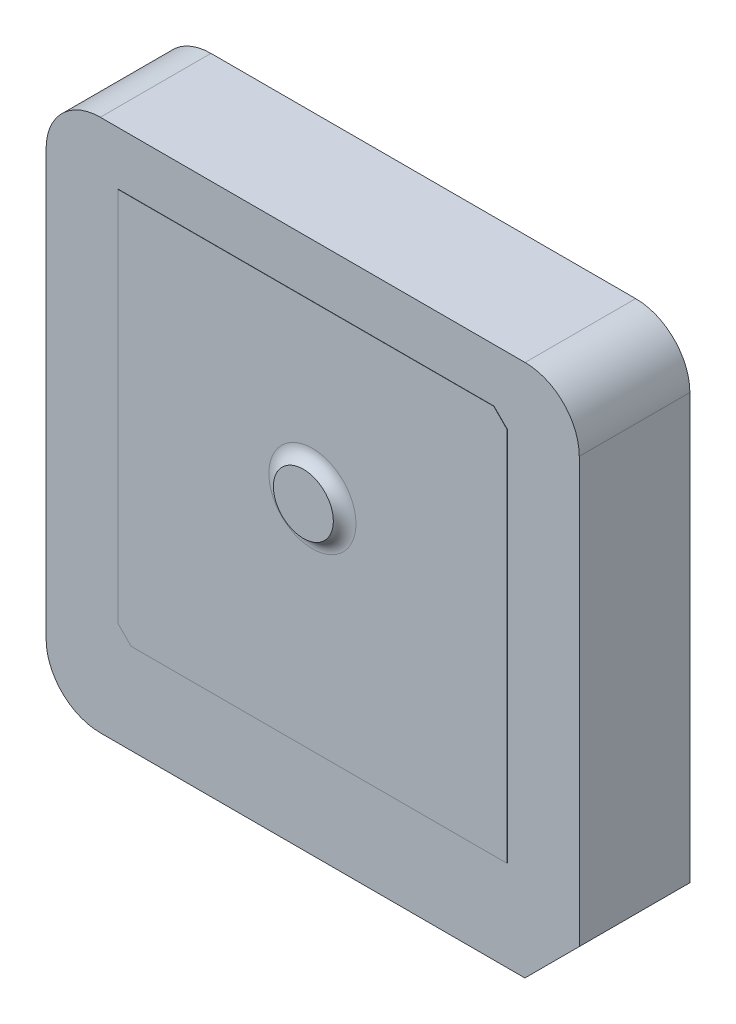
ISO-10303-21;
HEADER;
FILE_DESCRIPTION(('STEP AP214'),'2;1');
FILE_NAME('part.step','',(''),(''),'','','');
FILE_SCHEMA(('AUTOMOTIVE_DESIGN { 1 0 10303 214 1 1 1 1 }'));
ENDSEC;
DATA;
#1=APPLICATION_CONTEXT('core data for automotive mechanical design processes');
#2=APPLICATION_PROTOCOL_DEFINITION('international standard','automotive_design',2000,#1);
#3=PRODUCT_CONTEXT('',#1,'mechanical');
#4=PRODUCT('Part','Part','',(#3));
#5=PRODUCT_RELATED_PRODUCT_CATEGORY('part','',(#4));
#6=PRODUCT_DEFINITION_FORMATION('','',#4);
#7=PRODUCT_DEFINITION_CONTEXT('part definition',#1,'design');
#8=PRODUCT_DEFINITION('design','',#6,#7);
#9=PRODUCT_DEFINITION_SHAPE('','',#8);
#10=(LENGTH_UNIT() NAMED_UNIT(*) SI_UNIT(.MILLI.,.METRE.));
#11=(NAMED_UNIT(*) PLANE_ANGLE_UNIT() SI_UNIT($,.RADIAN.));
#12=(NAMED_UNIT(*) SI_UNIT($,.STERADIAN.) SOLID_ANGLE_UNIT());
#13=UNCERTAINTY_MEASURE_WITH_UNIT(LENGTH_MEASURE(1.E-05),#10,'distance_accuracy_value','');
#14=(GEOMETRIC_REPRESENTATION_CONTEXT(3) GLOBAL_UNCERTAINTY_ASSIGNED_CONTEXT((#13)) GLOBAL_UNIT_ASSIGNED_CONTEXT((#10,
#11,#12)) REPRESENTATION_CONTEXT('',''));
#15=CARTESIAN_POINT('',(0.,0.,0.));
#16=DIRECTION('',(0.,0.,1.));
#17=DIRECTION('',(1.,0.,0.));
#18=AXIS2_PLACEMENT_3D('',#15,#16,#17);
#19=CARTESIAN_POINT('',(-10.,10.,4.15));
#20=DIRECTION('',(1.,0.,0.));
#21=DIRECTION('',(0.,1.,0.));
#22=AXIS2_PLACEMENT_3D('',#19,#20,#21);
#23=PLANE('',#22);
#24=DIRECTION('',(0.,-1.,0.));
#25=VECTOR('',#24,1.);
#26=CARTESIAN_POINT('',(-10.,10.,4.15));
#27=LINE('',#26,#25);
#28=CARTESIAN_POINT('',(-10.,7.96690475583121,4.15));
#29=VERTEX_POINT('',#28);
#30=CARTESIAN_POINT('',(-10.,-7.96690475583121,4.15));
#31=VERTEX_POINT('',#30);
#32=EDGE_CURVE('E162',#29,#31,#27,.T.);
#33=ORIENTED_EDGE('',*,*,#32,.F.);
#34=DIRECTION('',(0.,0.,1.));
#35=VECTOR('',#34,1.);
#36=CARTESIAN_POINT('',(-10.,7.96690475583121,0.));
#37=LINE('',#36,#35);
#38=CARTESIAN_POINT('',(-10.,7.96690475583121,0.));
#39=VERTEX_POINT('',#38);
#40=EDGE_CURVE('E253',#39,#29,#37,.T.);
#41=ORIENTED_EDGE('',*,*,#40,.F.);
#42=DIRECTION('',(0.,-1.,0.));
#43=VECTOR('',#42,1.);
#44=CARTESIAN_POINT('',(-10.,10.,0.));
#45=LINE('',#44,#43);
#46=CARTESIAN_POINT('',(-10.,-7.96690475583121,0.));
#47=VERTEX_POINT('',#46);
#48=EDGE_CURVE('E164',#39,#47,#45,.T.);
#49=ORIENTED_EDGE('',*,*,#48,.T.);
#50=DIRECTION('',(0.,0.,1.));
#51=VECTOR('',#50,1.);
#52=CARTESIAN_POINT('',(-10.,-7.96690475583121,0.));
#53=LINE('',#52,#51);
#54=EDGE_CURVE('E252',#47,#31,#53,.T.);
#55=ORIENTED_EDGE('',*,*,#54,.T.);
#56=EDGE_LOOP('',(#33,#41,#49,#55));
#57=FACE_BOUND('',#56,.T.);
#58=ADVANCED_FACE('F37',(#57),#23,.F.);
#59=CARTESIAN_POINT('',(10.,10.,4.15));
#60=DIRECTION('',(-1.,0.,0.));
#61=DIRECTION('',(0.,0.,1.));
#62=AXIS2_PLACEMENT_3D('',#59,#60,#61);
#63=PLANE('',#62);
#64=DIRECTION('',(0.,0.,1.));
#65=VECTOR('',#64,1.);
#66=CARTESIAN_POINT('',(10.,7.96690475583121,0.));
#67=LINE('',#66,#65);
#68=CARTESIAN_POINT('',(10.,7.96690475583121,0.));
#69=VERTEX_POINT('',#68);
#70=CARTESIAN_POINT('',(10.,7.96690475583121,4.15));
#71=VERTEX_POINT('',#70);
#72=EDGE_CURVE('E60',#69,#71,#67,.T.);
#73=ORIENTED_EDGE('',*,*,#72,.T.);
#74=DIRECTION('',(0.,1.,0.));
#75=VECTOR('',#74,1.);
#76=CARTESIAN_POINT('',(10.,10.,4.15));
#77=LINE('',#76,#75);
#78=CARTESIAN_POINT('',(10.,-7.96051224213831,4.15));
#79=VERTEX_POINT('',#78);
#80=EDGE_CURVE('E152',#79,#71,#77,.T.);
#81=ORIENTED_EDGE('',*,*,#80,.F.);
#82=DIRECTION('',(0.,0.,1.));
#83=VECTOR('',#82,1.);
#84=CARTESIAN_POINT('',(10.,-7.96051224213831,0.));
#85=LINE('',#84,#83);
#86=CARTESIAN_POINT('',(10.,-7.96051224213831,0.));
#87=VERTEX_POINT('',#86);
#88=EDGE_CURVE('E138',#87,#79,#85,.T.);
#89=ORIENTED_EDGE('',*,*,#88,.F.);
#90=DIRECTION('',(0.,1.,0.));
#91=VECTOR('',#90,1.);
#92=CARTESIAN_POINT('',(10.,10.,0.));
#93=LINE('',#92,#91);
#94=EDGE_CURVE('E150',#87,#69,#93,.T.);
#95=ORIENTED_EDGE('',*,*,#94,.T.);
#96=EDGE_LOOP('',(#73,#81,#89,#95));
#97=FACE_BOUND('',#96,.T.);
#98=ADVANCED_FACE('F149',(#97),#63,.F.);
#99=CARTESIAN_POINT('',(-10.,10.,4.15));
#100=DIRECTION('',(0.,-1.,0.));
#101=DIRECTION('',(0.,0.,-1.));
#102=AXIS2_PLACEMENT_3D('',#99,#100,#101);
#103=PLANE('',#102);
#104=DIRECTION('',(0.,0.,1.));
#105=VECTOR('',#104,1.);
#106=CARTESIAN_POINT('',(-7.96690475583121,10.,0.));
#107=LINE('',#106,#105);
#108=CARTESIAN_POINT('',(-7.96690475583121,10.,0.));
#109=VERTEX_POINT('',#108);
#110=CARTESIAN_POINT('',(-7.96690475583121,10.,4.15));
#111=VERTEX_POINT('',#110);
#112=EDGE_CURVE('E264',#109,#111,#107,.T.);
#113=ORIENTED_EDGE('',*,*,#112,.T.);
#114=DIRECTION('',(-1.,0.,0.));
#115=VECTOR('',#114,1.);
#116=CARTESIAN_POINT('',(-10.,10.,4.15));
#117=LINE('',#116,#115);
#118=CARTESIAN_POINT('',(7.96690475583121,10.,4.15));
#119=VERTEX_POINT('',#118);
#120=EDGE_CURVE('E172',#119,#111,#117,.T.);
#121=ORIENTED_EDGE('',*,*,#120,.F.);
#122=DIRECTION('',(0.,0.,1.));
#123=VECTOR('',#122,1.);
#124=CARTESIAN_POINT('',(7.96690475583121,10.,0.));
#125=LINE('',#124,#123);
#126=CARTESIAN_POINT('',(7.96690475583121,10.,0.));
#127=VERTEX_POINT('',#126);
#128=EDGE_CURVE('E280',#127,#119,#125,.T.);
#129=ORIENTED_EDGE('',*,*,#128,.F.);
#130=DIRECTION('',(-1.,0.,0.));
#131=VECTOR('',#130,1.);
#132=CARTESIAN_POINT('',(-10.,10.,0.));
#133=LINE('',#132,#131);
#134=EDGE_CURVE('E158',#127,#109,#133,.T.);
#135=ORIENTED_EDGE('',*,*,#134,.T.);
#136=EDGE_LOOP('',(#113,#121,#129,#135));
#137=FACE_BOUND('',#136,.T.);
#138=ADVANCED_FACE('F290',(#137),#103,.F.);
#139=CARTESIAN_POINT('',(0.,0.,4.15));
#140=DIRECTION('',(0.,0.,1.));
#141=DIRECTION('',(1.,0.,0.));
#142=AXIS2_PLACEMENT_3D('',#139,#140,#141);
#143=PLANE('',#142);
#144=CARTESIAN_POINT('',(-7.96690475583121,7.96690475583121,4.15));
#145=DIRECTION('',(0.,0.,-1.));
#146=DIRECTION('',(-1.,0.,0.));
#147=AXIS2_PLACEMENT_3D('',#144,#145,#146);
#148=CIRCLE('',#147,2.03309524416879);
#149=EDGE_CURVE('E284',#29,#111,#148,.T.);
#150=ORIENTED_EDGE('',*,*,#149,.F.);
#151=ORIENTED_EDGE('',*,*,#32,.T.);
#152=CARTESIAN_POINT('',(-7.96690475583122,-7.96690475583121,4.15));
#153=DIRECTION('',(0.,0.,-1.));
#154=DIRECTION('',(-1.,0.,0.));
#155=AXIS2_PLACEMENT_3D('',#152,#153,#154);
#156=CIRCLE('',#155,2.03309524416879);
#157=CARTESIAN_POINT('',(-7.96690475583122,-10.,4.15));
#158=VERTEX_POINT('',#157);
#159=EDGE_CURVE('E260',#158,#31,#156,.T.);
#160=ORIENTED_EDGE('',*,*,#159,.F.);
#161=DIRECTION('',(1.,0.,0.));
#162=VECTOR('',#161,1.);
#163=CARTESIAN_POINT('',(-10.,-10.,4.15));
#164=LINE('',#163,#162);
#165=CARTESIAN_POINT('',(7.96051224213829,-10.,4.15));
#166=VERTEX_POINT('',#165);
#167=EDGE_CURVE('E242',#158,#166,#164,.T.);
#168=ORIENTED_EDGE('',*,*,#167,.T.);
#169=DIRECTION('',(-0.707106781186549,-0.707106781186546,0.));
#170=VECTOR('',#169,1.);
#171=CARTESIAN_POINT('',(7.96051224213829,-10.,4.15));
#172=LINE('',#171,#170);
#173=EDGE_CURVE('E144',#79,#166,#172,.T.);
#174=ORIENTED_EDGE('',*,*,#173,.F.);
#175=ORIENTED_EDGE('',*,*,#80,.T.);
#176=CARTESIAN_POINT('',(7.96690475583121,7.96690475583121,4.15));
#177=DIRECTION('',(0.,0.,-1.));
#178=DIRECTION('',(-1.,0.,0.));
#179=AXIS2_PLACEMENT_3D('',#176,#177,#178);
#180=CIRCLE('',#179,2.03309524416879);
#181=EDGE_CURVE('E278',#119,#71,#180,.T.);
#182=ORIENTED_EDGE('',*,*,#181,.F.);
#183=ORIENTED_EDGE('',*,*,#120,.T.);
#184=EDGE_LOOP('',(#150,#151,#160,#168,#174,#175,#182,#183));
#185=FACE_BOUND('',#184,.T.);
#186=DIRECTION('',(1.,0.,0.));
#187=VECTOR('',#186,1.);
#188=CARTESIAN_POINT('',(-7.3,-6.6,4.15));
#189=LINE('',#188,#187);
#190=CARTESIAN_POINT('',(-6.8,-6.6,4.15));
#191=VERTEX_POINT('',#190);
#192=CARTESIAN_POINT('',(7.3,-6.6,4.15));
#193=VERTEX_POINT('',#192);
#194=EDGE_CURVE('E195',#191,#193,#189,.T.);
#195=ORIENTED_EDGE('',*,*,#194,.F.);
#196=DIRECTION('',(0.707106781186545,-0.70710678118655,0.));
#197=VECTOR('',#196,1.);
#198=CARTESIAN_POINT('',(-6.8,-6.6,4.15));
#199=LINE('',#198,#197);
#200=CARTESIAN_POINT('',(-7.3,-6.1,4.15));
#201=VERTEX_POINT('',#200);
#202=EDGE_CURVE('E45',#191,#201,#199,.F.);
#203=ORIENTED_EDGE('',*,*,#202,.T.);
#204=DIRECTION('',(0.,-1.,0.));
#205=VECTOR('',#204,1.);
#206=CARTESIAN_POINT('',(-7.3,8.,4.15));
#207=LINE('',#206,#205);
#208=CARTESIAN_POINT('',(-7.3,8.,4.15));
#209=VERTEX_POINT('',#208);
#210=EDGE_CURVE('E193',#209,#201,#207,.T.);
#211=ORIENTED_EDGE('',*,*,#210,.F.);
#212=DIRECTION('',(-1.,0.,0.));
#213=VECTOR('',#212,1.);
#214=CARTESIAN_POINT('',(-7.3,8.,4.15));
#215=LINE('',#214,#213);
#216=CARTESIAN_POINT('',(6.8,8.,4.15));
#217=VERTEX_POINT('',#216);
#218=EDGE_CURVE('E225',#217,#209,#215,.T.);
#219=ORIENTED_EDGE('',*,*,#218,.F.);
#220=DIRECTION('',(-0.707106781186545,0.70710678118655,0.));
#221=VECTOR('',#220,1.);
#222=CARTESIAN_POINT('',(6.8,8.,4.15));
#223=LINE('',#222,#221);
#224=CARTESIAN_POINT('',(7.3,7.5,4.15));
#225=VERTEX_POINT('',#224);
#226=EDGE_CURVE('E186',#217,#225,#223,.F.);
#227=ORIENTED_EDGE('',*,*,#226,.T.);
#228=DIRECTION('',(0.,1.,0.));
#229=VECTOR('',#228,1.);
#230=CARTESIAN_POINT('',(7.3,8.,4.15));
#231=LINE('',#230,#229);
#232=EDGE_CURVE('E231',#193,#225,#231,.T.);
#233=ORIENTED_EDGE('',*,*,#232,.F.);
#234=EDGE_LOOP('',(#195,#203,#211,#219,#227,#233));
#235=FACE_BOUND('',#234,.T.);
#236=ADVANCED_FACE('F191',(#185,#235),#143,.T.);
#237=CARTESIAN_POINT('',(-10.,-10.,4.15));
#238=DIRECTION('',(0.,1.,0.));
#239=DIRECTION('',(0.,0.,1.));
#240=AXIS2_PLACEMENT_3D('',#237,#238,#239);
#241=PLANE('',#240);
#242=DIRECTION('',(1.,0.,0.));
#243=VECTOR('',#242,1.);
#244=CARTESIAN_POINT('',(-10.,-10.,0.));
#245=LINE('',#244,#243);
#246=CARTESIAN_POINT('',(-7.96690475583122,-10.,0.));
#247=VERTEX_POINT('',#246);
#248=CARTESIAN_POINT('',(7.96051224213829,-10.,0.));
#249=VERTEX_POINT('',#248);
#250=EDGE_CURVE('E159',#247,#249,#245,.T.);
#251=ORIENTED_EDGE('',*,*,#250,.T.);
#252=DIRECTION('',(0.,0.,1.));
#253=VECTOR('',#252,1.);
#254=CARTESIAN_POINT('',(7.96051224213829,-10.,0.));
#255=LINE('',#254,#253);
#256=EDGE_CURVE('E52',#249,#166,#255,.T.);
#257=ORIENTED_EDGE('',*,*,#256,.T.);
#258=ORIENTED_EDGE('',*,*,#167,.F.);
#259=DIRECTION('',(0.,0.,1.));
#260=VECTOR('',#259,1.);
#261=CARTESIAN_POINT('',(-7.96690475583122,-10.,0.));
#262=LINE('',#261,#260);
#263=EDGE_CURVE('E206',#247,#158,#262,.T.);
#264=ORIENTED_EDGE('',*,*,#263,.F.);
#265=EDGE_LOOP('',(#251,#257,#258,#264));
#266=FACE_BOUND('',#265,.T.);
#267=ADVANCED_FACE('F273',(#266),#241,.F.);
#268=CARTESIAN_POINT('',(0.,0.,0.));
#269=DIRECTION('',(0.,0.,1.));
#270=DIRECTION('',(1.,0.,0.));
#271=AXIS2_PLACEMENT_3D('',#268,#269,#270);
#272=PLANE('',#271);
#273=CARTESIAN_POINT('',(0.,1.6,0.));
#274=DIRECTION('',(0.,0.,1.));
#275=DIRECTION('',(1.,0.,0.));
#276=AXIS2_PLACEMENT_3D('',#273,#274,#275);
#277=CIRCLE('',#276,0.4);
#278=CARTESIAN_POINT('',(0.4,1.6,0.));
#279=VERTEX_POINT('',#278);
#280=EDGE_CURVE('E11',#279,#279,#277,.F.);
#281=ORIENTED_EDGE('',*,*,#280,.F.);
#282=EDGE_LOOP('',(#281));
#283=FACE_BOUND('',#282,.T.);
#284=ORIENTED_EDGE('',*,*,#48,.F.);
#285=CARTESIAN_POINT('',(-7.96690475583121,7.96690475583121,0.));
#286=DIRECTION('',(0.,0.,-1.));
#287=DIRECTION('',(-1.,0.,0.));
#288=AXIS2_PLACEMENT_3D('',#285,#286,#287);
#289=CIRCLE('',#288,2.03309524416879);
#290=EDGE_CURVE('E256',#39,#109,#289,.T.);
#291=ORIENTED_EDGE('',*,*,#290,.T.);
#292=ORIENTED_EDGE('',*,*,#134,.F.);
#293=CARTESIAN_POINT('',(7.96690475583121,7.96690475583121,0.));
#294=DIRECTION('',(0.,0.,-1.));
#295=DIRECTION('',(-1.,0.,0.));
#296=AXIS2_PLACEMENT_3D('',#293,#294,#295);
#297=CIRCLE('',#296,2.03309524416879);
#298=EDGE_CURVE('E157',#127,#69,#297,.T.);
#299=ORIENTED_EDGE('',*,*,#298,.T.);
#300=ORIENTED_EDGE('',*,*,#94,.F.);
#301=DIRECTION('',(-0.707106781186549,-0.707106781186546,0.));
#302=VECTOR('',#301,1.);
#303=CARTESIAN_POINT('',(7.96051224213829,-10.,0.));
#304=LINE('',#303,#302);
#305=EDGE_CURVE('E135',#87,#249,#304,.T.);
#306=ORIENTED_EDGE('',*,*,#305,.T.);
#307=ORIENTED_EDGE('',*,*,#250,.F.);
#308=CARTESIAN_POINT('',(-7.96690475583122,-7.96690475583121,0.));
#309=DIRECTION('',(0.,0.,-1.));
#310=DIRECTION('',(-1.,0.,0.));
#311=AXIS2_PLACEMENT_3D('',#308,#309,#310);
#312=CIRCLE('',#311,2.03309524416879);
#313=EDGE_CURVE('E257',#247,#47,#312,.T.);
#314=ORIENTED_EDGE('',*,*,#313,.T.);
#315=EDGE_LOOP('',(#284,#291,#292,#299,#300,#306,#307,#314));
#316=FACE_BOUND('',#315,.T.);
#317=ADVANCED_FACE('F155',(#283,#316),#272,.F.);
#318=CARTESIAN_POINT('',(-7.3,8.,4.16));
#319=DIRECTION('',(1.,0.,0.));
#320=DIRECTION('',(0.,1.,0.));
#321=AXIS2_PLACEMENT_3D('',#318,#319,#320);
#322=PLANE('',#321);
#323=ORIENTED_EDGE('',*,*,#210,.T.);
#324=DIRECTION('',(0.,0.,1.));
#325=VECTOR('',#324,1.);
#326=CARTESIAN_POINT('',(-7.3,-6.1,4.16));
#327=LINE('',#326,#325);
#328=CARTESIAN_POINT('',(-7.3,-6.1,4.16));
#329=VERTEX_POINT('',#328);
#330=EDGE_CURVE('E184',#201,#329,#327,.T.);
#331=ORIENTED_EDGE('',*,*,#330,.T.);
#332=DIRECTION('',(0.,-1.,0.));
#333=VECTOR('',#332,1.);
#334=CARTESIAN_POINT('',(-7.3,8.,4.16));
#335=LINE('',#334,#333);
#336=CARTESIAN_POINT('',(-7.3,8.,4.16));
#337=VERTEX_POINT('',#336);
#338=EDGE_CURVE('E215',#337,#329,#335,.T.);
#339=ORIENTED_EDGE('',*,*,#338,.F.);
#340=DIRECTION('',(0.,0.,-1.));
#341=VECTOR('',#340,1.);
#342=CARTESIAN_POINT('',(-7.3,8.,4.16));
#343=LINE('',#342,#341);
#344=EDGE_CURVE('E205',#337,#209,#343,.T.);
#345=ORIENTED_EDGE('',*,*,#344,.T.);
#346=EDGE_LOOP('',(#323,#331,#339,#345));
#347=FACE_BOUND('',#346,.T.);
#348=ADVANCED_FACE('F201',(#347),#322,.F.);
#349=CARTESIAN_POINT('',(-7.3,-6.6,4.16));
#350=DIRECTION('',(0.,1.,0.));
#351=DIRECTION('',(0.,0.,1.));
#352=AXIS2_PLACEMENT_3D('',#349,#350,#351);
#353=PLANE('',#352);
#354=DIRECTION('',(1.,0.,0.));
#355=VECTOR('',#354,1.);
#356=CARTESIAN_POINT('',(-7.3,-6.6,4.16));
#357=LINE('',#356,#355);
#358=CARTESIAN_POINT('',(-6.8,-6.6,4.16));
#359=VERTEX_POINT('',#358);
#360=CARTESIAN_POINT('',(7.3,-6.6,4.16));
#361=VERTEX_POINT('',#360);
#362=EDGE_CURVE('E213',#359,#361,#357,.T.);
#363=ORIENTED_EDGE('',*,*,#362,.F.);
#364=DIRECTION('',(0.,0.,-1.));
#365=VECTOR('',#364,1.);
#366=CARTESIAN_POINT('',(-6.8,-6.6,4.16));
#367=LINE('',#366,#365);
#368=EDGE_CURVE('E181',#359,#191,#367,.T.);
#369=ORIENTED_EDGE('',*,*,#368,.T.);
#370=ORIENTED_EDGE('',*,*,#194,.T.);
#371=DIRECTION('',(0.,0.,-1.));
#372=VECTOR('',#371,1.);
#373=CARTESIAN_POINT('',(7.3,-6.6,4.16));
#374=LINE('',#373,#372);
#375=EDGE_CURVE('E219',#361,#193,#374,.T.);
#376=ORIENTED_EDGE('',*,*,#375,.F.);
#377=EDGE_LOOP('',(#363,#369,#370,#376));
#378=FACE_BOUND('',#377,.T.);
#379=ADVANCED_FACE('F217',(#378),#353,.F.);
#380=CARTESIAN_POINT('',(7.3,8.,4.16));
#381=DIRECTION('',(-1.,0.,0.));
#382=DIRECTION('',(0.,-1.,0.));
#383=AXIS2_PLACEMENT_3D('',#380,#381,#382);
#384=PLANE('',#383);
#385=ORIENTED_EDGE('',*,*,#232,.T.);
#386=DIRECTION('',(0.,0.,1.));
#387=VECTOR('',#386,1.);
#388=CARTESIAN_POINT('',(7.3,7.5,4.16));
#389=LINE('',#388,#387);
#390=CARTESIAN_POINT('',(7.3,7.5,4.16));
#391=VERTEX_POINT('',#390);
#392=EDGE_CURVE('E175',#225,#391,#389,.T.);
#393=ORIENTED_EDGE('',*,*,#392,.T.);
#394=DIRECTION('',(0.,1.,0.));
#395=VECTOR('',#394,1.);
#396=CARTESIAN_POINT('',(7.3,8.,4.16));
#397=LINE('',#396,#395);
#398=EDGE_CURVE('E221',#361,#391,#397,.T.);
#399=ORIENTED_EDGE('',*,*,#398,.F.);
#400=ORIENTED_EDGE('',*,*,#375,.T.);
#401=EDGE_LOOP('',(#385,#393,#399,#400));
#402=FACE_BOUND('',#401,.T.);
#403=ADVANCED_FACE('F329',(#402),#384,.F.);
#404=CARTESIAN_POINT('',(-7.3,8.,4.16));
#405=DIRECTION('',(0.,-1.,0.));
#406=DIRECTION('',(0.,0.,-1.));
#407=AXIS2_PLACEMENT_3D('',#404,#405,#406);
#408=PLANE('',#407);
#409=DIRECTION('',(-1.,0.,0.));
#410=VECTOR('',#409,1.);
#411=CARTESIAN_POINT('',(-7.3,8.,4.16));
#412=LINE('',#411,#410);
#413=CARTESIAN_POINT('',(6.8,8.,4.16));
#414=VERTEX_POINT('',#413);
#415=EDGE_CURVE('E223',#414,#337,#412,.T.);
#416=ORIENTED_EDGE('',*,*,#415,.F.);
#417=DIRECTION('',(0.,0.,-1.));
#418=VECTOR('',#417,1.);
#419=CARTESIAN_POINT('',(6.8,8.,4.16));
#420=LINE('',#419,#418);
#421=EDGE_CURVE('E171',#414,#217,#420,.T.);
#422=ORIENTED_EDGE('',*,*,#421,.T.);
#423=ORIENTED_EDGE('',*,*,#218,.T.);
#424=ORIENTED_EDGE('',*,*,#344,.F.);
#425=EDGE_LOOP('',(#416,#422,#423,#424));
#426=FACE_BOUND('',#425,.T.);
#427=ADVANCED_FACE('F327',(#426),#408,.F.);
#428=CARTESIAN_POINT('',(0.,0.,4.16));
#429=DIRECTION('',(0.,0.,1.));
#430=DIRECTION('',(1.,0.,0.));
#431=AXIS2_PLACEMENT_3D('',#428,#429,#430);
#432=PLANE('',#431);
#433=CARTESIAN_POINT('',(0.,1.6,4.16));
#434=DIRECTION('',(0.,0.,1.));
#435=DIRECTION('',(1.,0.,0.));
#436=AXIS2_PLACEMENT_3D('',#433,#434,#435);
#437=CIRCLE('',#436,1.63333060108555);
#438=CARTESIAN_POINT('',(1.63333060108555,1.6,4.16));
#439=VERTEX_POINT('',#438);
#440=EDGE_CURVE('E168',#439,#439,#437,.F.);
#441=ORIENTED_EDGE('',*,*,#440,.T.);
#442=EDGE_LOOP('',(#441));
#443=FACE_BOUND('',#442,.T.);
#444=ORIENTED_EDGE('',*,*,#398,.T.);
#445=DIRECTION('',(0.707106781186545,-0.70710678118655,0.));
#446=VECTOR('',#445,1.);
#447=CARTESIAN_POINT('',(7.40000000000002,7.39999999999997,4.16));
#448=LINE('',#447,#446);
#449=EDGE_CURVE('E179',#391,#414,#448,.F.);
#450=ORIENTED_EDGE('',*,*,#449,.T.);
#451=ORIENTED_EDGE('',*,*,#415,.T.);
#452=ORIENTED_EDGE('',*,*,#338,.T.);
#453=DIRECTION('',(-0.707106781186545,0.70710678118655,0.));
#454=VECTOR('',#453,1.);
#455=CARTESIAN_POINT('',(-6.70000000000002,-6.69999999999998,4.16));
#456=LINE('',#455,#454);
#457=EDGE_CURVE('E177',#329,#359,#456,.F.);
#458=ORIENTED_EDGE('',*,*,#457,.T.);
#459=ORIENTED_EDGE('',*,*,#362,.T.);
#460=EDGE_LOOP('',(#444,#450,#451,#452,#458,#459));
#461=FACE_BOUND('',#460,.T.);
#462=ADVANCED_FACE('F212',(#443,#461),#432,.T.);
#463=CARTESIAN_POINT('',(0.,1.6,4.5));
#464=DIRECTION('',(0.,0.,1.));
#465=DIRECTION('',(1.,0.,0.));
#466=AXIS2_PLACEMENT_3D('',#463,#464,#465);
#467=PLANE('',#466);
#468=CARTESIAN_POINT('',(0.,1.6,4.5));
#469=DIRECTION('',(0.,0.,1.));
#470=DIRECTION('',(1.,0.,0.));
#471=AXIS2_PLACEMENT_3D('',#468,#469,#470);
#472=CIRCLE('',#471,1.125);
#473=CARTESIAN_POINT('',(1.125,1.6,4.5));
#474=VERTEX_POINT('',#473);
#475=EDGE_CURVE('E237',#474,#474,#472,.T.);
#476=ORIENTED_EDGE('',*,*,#475,.T.);
#477=EDGE_LOOP('',(#476));
#478=FACE_BOUND('',#477,.T.);
#479=ADVANCED_FACE('F315',(#478),#467,.T.);
#480=CARTESIAN_POINT('',(0.,1.6,4.71));
#481=DIRECTION('',(0.,0.,1.));
#482=DIRECTION('',(1.,0.,0.));
#483=AXIS2_PLACEMENT_3D('',#480,#481,#482);
#484=TOROIDAL_SURFACE('',#483,1.63333060108555,0.55);
#485=ORIENTED_EDGE('',*,*,#440,.F.);
#486=EDGE_LOOP('',(#485));
#487=FACE_BOUND('',#486,.T.);
#488=ORIENTED_EDGE('',*,*,#475,.F.);
#489=EDGE_LOOP('',(#488));
#490=FACE_BOUND('',#489,.T.);
#491=ADVANCED_FACE('F312',(#487,#490),#484,.F.);
#492=CARTESIAN_POINT('',(6.8,8.,4.16));
#493=DIRECTION('',(-0.70710678118655,-0.707106781186545,0.));
#494=DIRECTION('',(0.,0.,-1.));
#495=AXIS2_PLACEMENT_3D('',#492,#493,#494);
#496=PLANE('',#495);
#497=ORIENTED_EDGE('',*,*,#449,.F.);
#498=ORIENTED_EDGE('',*,*,#392,.F.);
#499=ORIENTED_EDGE('',*,*,#226,.F.);
#500=ORIENTED_EDGE('',*,*,#421,.F.);
#501=EDGE_LOOP('',(#497,#498,#499,#500));
#502=FACE_BOUND('',#501,.T.);
#503=ADVANCED_FACE('F314',(#502),#496,.F.);
#504=CARTESIAN_POINT('',(-6.8,-6.6,4.16));
#505=DIRECTION('',(0.70710678118655,0.707106781186545,0.));
#506=DIRECTION('',(0.,0.,-1.));
#507=AXIS2_PLACEMENT_3D('',#504,#505,#506);
#508=PLANE('',#507);
#509=ORIENTED_EDGE('',*,*,#457,.F.);
#510=ORIENTED_EDGE('',*,*,#330,.F.);
#511=ORIENTED_EDGE('',*,*,#202,.F.);
#512=ORIENTED_EDGE('',*,*,#368,.F.);
#513=EDGE_LOOP('',(#509,#510,#511,#512));
#514=FACE_BOUND('',#513,.T.);
#515=ADVANCED_FACE('F39',(#514),#508,.F.);
#516=CARTESIAN_POINT('',(-7.96690475583122,-7.96690475583121,0.));
#517=DIRECTION('',(0.,0.,1.));
#518=DIRECTION('',(1.,0.,0.));
#519=AXIS2_PLACEMENT_3D('',#516,#517,#518);
#520=CYLINDRICAL_SURFACE('',#519,2.03309524416879);
#521=ORIENTED_EDGE('',*,*,#159,.T.);
#522=ORIENTED_EDGE('',*,*,#54,.F.);
#523=ORIENTED_EDGE('',*,*,#313,.F.);
#524=ORIENTED_EDGE('',*,*,#263,.T.);
#525=EDGE_LOOP('',(#521,#522,#523,#524));
#526=FACE_BOUND('',#525,.T.);
#527=ADVANCED_FACE('F268',(#526),#520,.T.);
#528=CARTESIAN_POINT('',(7.96051224213829,-10.,0.));
#529=DIRECTION('',(-0.707106781186546,0.707106781186549,0.));
#530=DIRECTION('',(-0.707106781186549,-0.707106781186546,0.));
#531=AXIS2_PLACEMENT_3D('',#528,#529,#530);
#532=PLANE('',#531);
#533=ORIENTED_EDGE('',*,*,#173,.T.);
#534=ORIENTED_EDGE('',*,*,#256,.F.);
#535=ORIENTED_EDGE('',*,*,#305,.F.);
#536=ORIENTED_EDGE('',*,*,#88,.T.);
#537=EDGE_LOOP('',(#533,#534,#535,#536));
#538=FACE_BOUND('',#537,.T.);
#539=ADVANCED_FACE('F137',(#538),#532,.F.);
#540=CARTESIAN_POINT('',(7.96690475583121,7.96690475583121,0.));
#541=DIRECTION('',(0.,0.,1.));
#542=DIRECTION('',(1.,0.,0.));
#543=AXIS2_PLACEMENT_3D('',#540,#541,#542);
#544=CYLINDRICAL_SURFACE('',#543,2.03309524416879);
#545=ORIENTED_EDGE('',*,*,#181,.T.);
#546=ORIENTED_EDGE('',*,*,#72,.F.);
#547=ORIENTED_EDGE('',*,*,#298,.F.);
#548=ORIENTED_EDGE('',*,*,#128,.T.);
#549=EDGE_LOOP('',(#545,#546,#547,#548));
#550=FACE_BOUND('',#549,.T.);
#551=ADVANCED_FACE('F293',(#550),#544,.T.);
#552=CARTESIAN_POINT('',(-7.96690475583121,7.96690475583121,0.));
#553=DIRECTION('',(0.,0.,1.));
#554=DIRECTION('',(1.,0.,0.));
#555=AXIS2_PLACEMENT_3D('',#552,#553,#554);
#556=CYLINDRICAL_SURFACE('',#555,2.03309524416879);
#557=ORIENTED_EDGE('',*,*,#149,.T.);
#558=ORIENTED_EDGE('',*,*,#112,.F.);
#559=ORIENTED_EDGE('',*,*,#290,.F.);
#560=ORIENTED_EDGE('',*,*,#40,.T.);
#561=EDGE_LOOP('',(#557,#558,#559,#560));
#562=FACE_BOUND('',#561,.T.);
#563=ADVANCED_FACE('F295',(#562),#556,.T.);
#564=CARTESIAN_POINT('',(0.,1.6,-2.));
#565=DIRECTION('',(0.,0.,1.));
#566=DIRECTION('',(1.,0.,0.));
#567=AXIS2_PLACEMENT_3D('',#564,#565,#566);
#568=CYLINDRICAL_SURFACE('',#567,0.4);
#569=CARTESIAN_POINT('',(0.,1.6,-2.));
#570=DIRECTION('',(0.,0.,-1.));
#571=DIRECTION('',(-1.,0.,0.));
#572=AXIS2_PLACEMENT_3D('',#569,#570,#571);
#573=CIRCLE('',#572,0.4);
#574=CARTESIAN_POINT('',(-0.4,1.6,-2.));
#575=VERTEX_POINT('',#574);
#576=EDGE_CURVE('E285',#575,#575,#573,.T.);
#577=ORIENTED_EDGE('',*,*,#576,.F.);
#578=EDGE_LOOP('',(#577));
#579=FACE_BOUND('',#578,.T.);
#580=ORIENTED_EDGE('',*,*,#280,.T.);
#581=EDGE_LOOP('',(#580));
#582=FACE_BOUND('',#581,.T.);
#583=ADVANCED_FACE('F301',(#579,#582),#568,.T.);
#584=CARTESIAN_POINT('',(0.,1.6,-2.));
#585=DIRECTION('',(0.,0.,-1.));
#586=DIRECTION('',(-1.,0.,0.));
#587=AXIS2_PLACEMENT_3D('',#584,#585,#586);
#588=PLANE('',#587);
#589=ORIENTED_EDGE('',*,*,#576,.T.);
#590=EDGE_LOOP('',(#589));
#591=FACE_BOUND('',#590,.T.);
#592=ADVANCED_FACE('F447',(#591),#588,.T.);
#593=CLOSED_SHELL('',(#58,#98,#138,#236,#267,#317,#348,#379,#403,#427,#462,#479,#491,#503,#515,
#527,#539,#551,#563,#583,#592));
#594=MANIFOLD_SOLID_BREP('B2',#593);
#595=ADVANCED_BREP_SHAPE_REPRESENTATION('',(#18,#594),#14);
#596=SHAPE_DEFINITION_REPRESENTATION(#9,#595);
ENDSEC;
END-ISO-10303-21;
